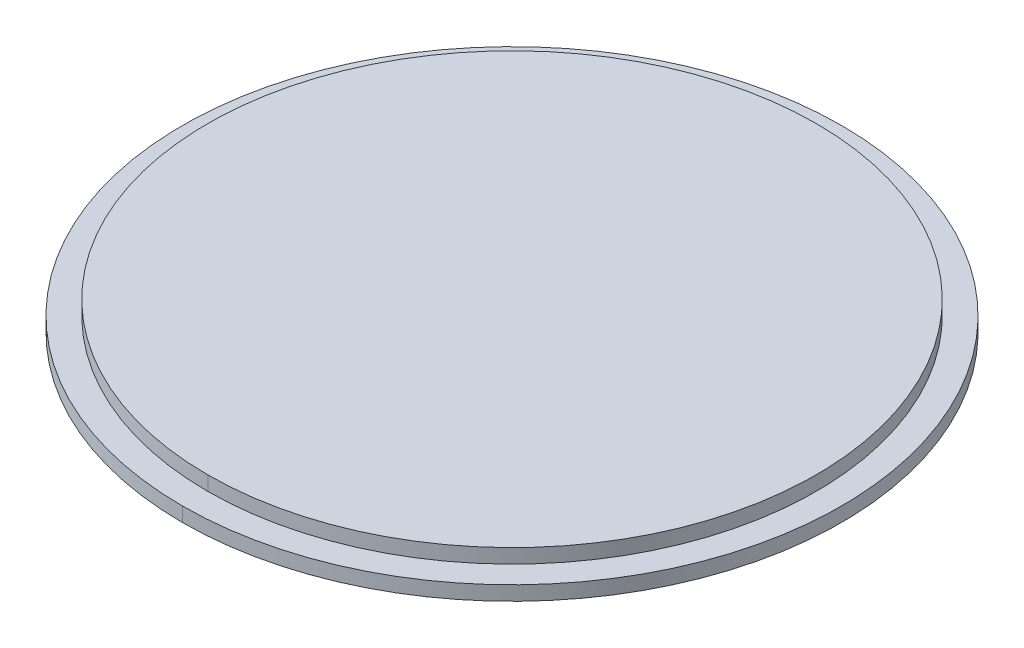
ISO-10303-21;
HEADER;
FILE_DESCRIPTION(('STEP AP214'),'2;1');
FILE_NAME('part.step','',(''),(''),'','','');
FILE_SCHEMA(('AUTOMOTIVE_DESIGN { 1 0 10303 214 1 1 1 1 }'));
ENDSEC;
DATA;
#1=APPLICATION_CONTEXT('core data for automotive mechanical design processes');
#2=APPLICATION_PROTOCOL_DEFINITION('international standard','automotive_design',2000,#1);
#3=PRODUCT_CONTEXT('',#1,'mechanical');
#4=PRODUCT('Part','Part','',(#3));
#5=PRODUCT_RELATED_PRODUCT_CATEGORY('part','',(#4));
#6=PRODUCT_DEFINITION_FORMATION('','',#4);
#7=PRODUCT_DEFINITION_CONTEXT('part definition',#1,'design');
#8=PRODUCT_DEFINITION('design','',#6,#7);
#9=PRODUCT_DEFINITION_SHAPE('','',#8);
#10=(LENGTH_UNIT() NAMED_UNIT(*) SI_UNIT(.MILLI.,.METRE.));
#11=(NAMED_UNIT(*) PLANE_ANGLE_UNIT() SI_UNIT($,.RADIAN.));
#12=(NAMED_UNIT(*) SI_UNIT($,.STERADIAN.) SOLID_ANGLE_UNIT());
#13=UNCERTAINTY_MEASURE_WITH_UNIT(LENGTH_MEASURE(1.E-05),#10,'distance_accuracy_value','');
#14=(GEOMETRIC_REPRESENTATION_CONTEXT(3) GLOBAL_UNCERTAINTY_ASSIGNED_CONTEXT((#13)) GLOBAL_UNIT_ASSIGNED_CONTEXT((#10,
#11,#12)) REPRESENTATION_CONTEXT('',''));
#15=CARTESIAN_POINT('',(0.,0.,0.));
#16=DIRECTION('',(0.,0.,1.));
#17=DIRECTION('',(1.,0.,0.));
#18=AXIS2_PLACEMENT_3D('',#15,#16,#17);
#19=CARTESIAN_POINT('',(0.,-4.49999999999985,0.));
#20=DIRECTION('',(0.,1.,0.));
#21=DIRECTION('',(0.,0.,-1.));
#22=AXIS2_PLACEMENT_3D('',#19,#20,#21);
#23=PLANE('',#22);
#24=CARTESIAN_POINT('',(0.,-4.49999999999985,0.));
#25=DIRECTION('',(0.,1.,0.));
#26=DIRECTION('',(0.,0.,-1.));
#27=AXIS2_PLACEMENT_3D('',#24,#25,#26);
#28=CIRCLE('',#27,31.85);
#29=CARTESIAN_POINT('',(0.,-4.49999999999985,-31.85));
#30=VERTEX_POINT('',#29);
#31=CARTESIAN_POINT('',(0.,-4.49999999999984,31.85));
#32=VERTEX_POINT('',#31);
#33=EDGE_CURVE('E26',#30,#32,#28,.T.);
#34=ORIENTED_EDGE('',*,*,#33,.F.);
#35=CARTESIAN_POINT('',(0.,-4.49999999999985,0.));
#36=DIRECTION('',(0.,-1.,0.));
#37=DIRECTION('',(0.,0.,-1.));
#38=AXIS2_PLACEMENT_3D('',#35,#36,#37);
#39=CIRCLE('',#38,31.85);
#40=EDGE_CURVE('E9',#30,#32,#39,.T.);
#41=ORIENTED_EDGE('',*,*,#40,.T.);
#42=EDGE_LOOP('',(#34,#41));
#43=FACE_BOUND('',#42,.T.);
#44=ADVANCED_FACE('F15',(#43),#23,.F.);
#45=CARTESIAN_POINT('',(0.,-4.72499999999984,0.));
#46=DIRECTION('',(0.,-1.,0.));
#47=DIRECTION('',(0.,0.,-1.));
#48=AXIS2_PLACEMENT_3D('',#45,#46,#47);
#49=CYLINDRICAL_SURFACE('',#48,31.85);
#50=ORIENTED_EDGE('',*,*,#33,.T.);
#51=DIRECTION('',(0.,1.,0.));
#52=VECTOR('',#51,1.);
#53=CARTESIAN_POINT('',(0.,-4.49999999999984,31.85));
#54=LINE('',#53,#52);
#55=CARTESIAN_POINT('',(0.,-2.9999999999999,31.85));
#56=VERTEX_POINT('',#55);
#57=EDGE_CURVE('E110',#32,#56,#54,.T.);
#58=ORIENTED_EDGE('',*,*,#57,.T.);
#59=CARTESIAN_POINT('',(0.,-2.9999999999999,0.));
#60=DIRECTION('',(0.,1.,0.));
#61=DIRECTION('',(0.,0.,-1.));
#62=AXIS2_PLACEMENT_3D('',#59,#60,#61);
#63=CIRCLE('',#62,31.85);
#64=CARTESIAN_POINT('',(0.,-2.9999999999999,-31.85));
#65=VERTEX_POINT('',#64);
#66=EDGE_CURVE('E120',#65,#56,#63,.T.);
#67=ORIENTED_EDGE('',*,*,#66,.F.);
#68=DIRECTION('',(0.,1.,0.));
#69=VECTOR('',#68,1.);
#70=CARTESIAN_POINT('',(0.,-4.49999999999985,-31.85));
#71=LINE('',#70,#69);
#72=EDGE_CURVE('E111',#30,#65,#71,.T.);
#73=ORIENTED_EDGE('',*,*,#72,.F.);
#74=EDGE_LOOP('',(#50,#58,#67,#73));
#75=FACE_BOUND('',#74,.T.);
#76=ADVANCED_FACE('F135',(#75),#49,.T.);
#77=CARTESIAN_POINT('',(0.,-4.72499999999984,0.));
#78=DIRECTION('',(0.,-1.,0.));
#79=DIRECTION('',(0.,0.,-1.));
#80=AXIS2_PLACEMENT_3D('',#77,#78,#79);
#81=CYLINDRICAL_SURFACE('',#80,31.85);
#82=CARTESIAN_POINT('',(0.,-2.9999999999999,0.));
#83=DIRECTION('',(0.,-1.,0.));
#84=DIRECTION('',(0.,0.,-1.));
#85=AXIS2_PLACEMENT_3D('',#82,#83,#84);
#86=CIRCLE('',#85,31.85);
#87=EDGE_CURVE('E107',#65,#56,#86,.T.);
#88=ORIENTED_EDGE('',*,*,#87,.T.);
#89=ORIENTED_EDGE('',*,*,#57,.F.);
#90=ORIENTED_EDGE('',*,*,#40,.F.);
#91=ORIENTED_EDGE('',*,*,#72,.T.);
#92=EDGE_LOOP('',(#88,#89,#90,#91));
#93=FACE_BOUND('',#92,.T.);
#94=ADVANCED_FACE('F129',(#93),#81,.T.);
#95=CARTESIAN_POINT('',(0.,-2.9999999999999,0.));
#96=DIRECTION('',(0.,1.,0.));
#97=DIRECTION('',(0.,0.,-1.));
#98=AXIS2_PLACEMENT_3D('',#95,#96,#97);
#99=PLANE('',#98);
#100=ORIENTED_EDGE('',*,*,#66,.T.);
#101=ORIENTED_EDGE('',*,*,#87,.F.);
#102=EDGE_LOOP('',(#100,#101));
#103=FACE_BOUND('',#102,.T.);
#104=CARTESIAN_POINT('',(0.,-2.9999999999999,0.));
#105=DIRECTION('',(0.,-1.,0.));
#106=DIRECTION('',(0.,0.,-1.));
#107=AXIS2_PLACEMENT_3D('',#104,#105,#106);
#108=CIRCLE('',#107,34.5);
#109=CARTESIAN_POINT('',(0.,-2.9999999999999,-34.5));
#110=VERTEX_POINT('',#109);
#111=CARTESIAN_POINT('',(0.,-2.9999999999999,34.5));
#112=VERTEX_POINT('',#111);
#113=EDGE_CURVE('E119',#110,#112,#108,.T.);
#114=ORIENTED_EDGE('',*,*,#113,.T.);
#115=CARTESIAN_POINT('',(0.,-2.9999999999999,0.));
#116=DIRECTION('',(0.,1.,0.));
#117=DIRECTION('',(0.,0.,-1.));
#118=AXIS2_PLACEMENT_3D('',#115,#116,#117);
#119=CIRCLE('',#118,34.5);
#120=EDGE_CURVE('E93',#110,#112,#119,.T.);
#121=ORIENTED_EDGE('',*,*,#120,.F.);
#122=EDGE_LOOP('',(#114,#121));
#123=FACE_BOUND('',#122,.T.);
#124=ADVANCED_FACE('F133',(#103,#123),#99,.F.);
#125=CARTESIAN_POINT('',(0.,-4.72499999999984,0.));
#126=DIRECTION('',(0.,-1.,0.));
#127=DIRECTION('',(0.,0.,-1.));
#128=AXIS2_PLACEMENT_3D('',#125,#126,#127);
#129=CYLINDRICAL_SURFACE('',#128,34.5);
#130=CARTESIAN_POINT('',(0.,-1.5,0.));
#131=DIRECTION('',(0.,-1.,0.));
#132=DIRECTION('',(0.,0.,-1.));
#133=AXIS2_PLACEMENT_3D('',#130,#131,#132);
#134=CIRCLE('',#133,34.5);
#135=CARTESIAN_POINT('',(0.,-1.5,-34.5));
#136=VERTEX_POINT('',#135);
#137=CARTESIAN_POINT('',(0.,-1.5,34.5));
#138=VERTEX_POINT('',#137);
#139=EDGE_CURVE('E106',#136,#138,#134,.T.);
#140=ORIENTED_EDGE('',*,*,#139,.T.);
#141=DIRECTION('',(0.,1.,0.));
#142=VECTOR('',#141,1.);
#143=CARTESIAN_POINT('',(0.,-2.9999999999999,34.5));
#144=LINE('',#143,#142);
#145=EDGE_CURVE('E97',#112,#138,#144,.T.);
#146=ORIENTED_EDGE('',*,*,#145,.F.);
#147=ORIENTED_EDGE('',*,*,#113,.F.);
#148=DIRECTION('',(0.,1.,0.));
#149=VECTOR('',#148,1.);
#150=CARTESIAN_POINT('',(0.,-2.9999999999999,-34.5));
#151=LINE('',#150,#149);
#152=EDGE_CURVE('E96',#110,#136,#151,.T.);
#153=ORIENTED_EDGE('',*,*,#152,.T.);
#154=EDGE_LOOP('',(#140,#146,#147,#153));
#155=FACE_BOUND('',#154,.T.);
#156=ADVANCED_FACE('F153',(#155),#129,.T.);
#157=CARTESIAN_POINT('',(0.,-4.72499999999984,0.));
#158=DIRECTION('',(0.,-1.,0.));
#159=DIRECTION('',(0.,0.,-1.));
#160=AXIS2_PLACEMENT_3D('',#157,#158,#159);
#161=CYLINDRICAL_SURFACE('',#160,34.5);
#162=ORIENTED_EDGE('',*,*,#120,.T.);
#163=ORIENTED_EDGE('',*,*,#145,.T.);
#164=CARTESIAN_POINT('',(0.,-1.5,0.));
#165=DIRECTION('',(0.,1.,0.));
#166=DIRECTION('',(0.,0.,-1.));
#167=AXIS2_PLACEMENT_3D('',#164,#165,#166);
#168=CIRCLE('',#167,34.5);
#169=EDGE_CURVE('E98',#136,#138,#168,.T.);
#170=ORIENTED_EDGE('',*,*,#169,.F.);
#171=ORIENTED_EDGE('',*,*,#152,.F.);
#172=EDGE_LOOP('',(#162,#163,#170,#171));
#173=FACE_BOUND('',#172,.T.);
#174=ADVANCED_FACE('F156',(#173),#161,.T.);
#175=CARTESIAN_POINT('',(0.,-1.5,0.));
#176=DIRECTION('',(0.,1.,0.));
#177=DIRECTION('',(0.,0.,-1.));
#178=AXIS2_PLACEMENT_3D('',#175,#176,#177);
#179=PLANE('',#178);
#180=ORIENTED_EDGE('',*,*,#169,.T.);
#181=ORIENTED_EDGE('',*,*,#139,.F.);
#182=EDGE_LOOP('',(#180,#181));
#183=FACE_BOUND('',#182,.T.);
#184=CARTESIAN_POINT('',(0.,-1.5,0.));
#185=DIRECTION('',(0.,-1.,0.));
#186=DIRECTION('',(0.,0.,-1.));
#187=AXIS2_PLACEMENT_3D('',#184,#185,#186);
#188=CIRCLE('',#187,31.85);
#189=CARTESIAN_POINT('',(0.,-1.5,-31.85));
#190=VERTEX_POINT('',#189);
#191=CARTESIAN_POINT('',(0.,-1.5,31.85));
#192=VERTEX_POINT('',#191);
#193=EDGE_CURVE('E72',#190,#192,#188,.T.);
#194=ORIENTED_EDGE('',*,*,#193,.T.);
#195=CARTESIAN_POINT('',(0.,-1.5,0.));
#196=DIRECTION('',(0.,1.,0.));
#197=DIRECTION('',(0.,0.,-1.));
#198=AXIS2_PLACEMENT_3D('',#195,#196,#197);
#199=CIRCLE('',#198,31.85);
#200=EDGE_CURVE('E19',#190,#192,#199,.T.);
#201=ORIENTED_EDGE('',*,*,#200,.F.);
#202=EDGE_LOOP('',(#194,#201));
#203=FACE_BOUND('',#202,.T.);
#204=ADVANCED_FACE('F146',(#183,#203),#179,.T.);
#205=CARTESIAN_POINT('',(0.,-4.72499999999984,0.));
#206=DIRECTION('',(0.,-1.,0.));
#207=DIRECTION('',(0.,0.,-1.));
#208=AXIS2_PLACEMENT_3D('',#205,#206,#207);
#209=CYLINDRICAL_SURFACE('',#208,31.85);
#210=CARTESIAN_POINT('',(0.,0.,0.));
#211=DIRECTION('',(0.,-1.,0.));
#212=DIRECTION('',(0.,0.,-1.));
#213=AXIS2_PLACEMENT_3D('',#210,#211,#212);
#214=CIRCLE('',#213,31.85);
#215=CARTESIAN_POINT('',(0.,0.,-31.85));
#216=VERTEX_POINT('',#215);
#217=CARTESIAN_POINT('',(0.,0.,31.85));
#218=VERTEX_POINT('',#217);
#219=EDGE_CURVE('E69',#216,#218,#214,.T.);
#220=ORIENTED_EDGE('',*,*,#219,.T.);
#221=DIRECTION('',(0.,1.,0.));
#222=VECTOR('',#221,1.);
#223=CARTESIAN_POINT('',(0.,-1.5,31.85));
#224=LINE('',#223,#222);
#225=EDGE_CURVE('E82',#192,#218,#224,.T.);
#226=ORIENTED_EDGE('',*,*,#225,.F.);
#227=ORIENTED_EDGE('',*,*,#193,.F.);
#228=DIRECTION('',(0.,1.,0.));
#229=VECTOR('',#228,1.);
#230=CARTESIAN_POINT('',(0.,-1.5,-31.85));
#231=LINE('',#230,#229);
#232=EDGE_CURVE('E65',#190,#216,#231,.T.);
#233=ORIENTED_EDGE('',*,*,#232,.T.);
#234=EDGE_LOOP('',(#220,#226,#227,#233));
#235=FACE_BOUND('',#234,.T.);
#236=ADVANCED_FACE('F67',(#235),#209,.T.);
#237=CARTESIAN_POINT('',(0.,-4.72499999999984,0.));
#238=DIRECTION('',(0.,-1.,0.));
#239=DIRECTION('',(0.,0.,-1.));
#240=AXIS2_PLACEMENT_3D('',#237,#238,#239);
#241=CYLINDRICAL_SURFACE('',#240,31.85);
#242=ORIENTED_EDGE('',*,*,#200,.T.);
#243=ORIENTED_EDGE('',*,*,#225,.T.);
#244=CARTESIAN_POINT('',(0.,0.,0.));
#245=DIRECTION('',(0.,1.,0.));
#246=DIRECTION('',(0.,0.,-1.));
#247=AXIS2_PLACEMENT_3D('',#244,#245,#246);
#248=CIRCLE('',#247,31.85);
#249=EDGE_CURVE('E78',#216,#218,#248,.T.);
#250=ORIENTED_EDGE('',*,*,#249,.F.);
#251=ORIENTED_EDGE('',*,*,#232,.F.);
#252=EDGE_LOOP('',(#242,#243,#250,#251));
#253=FACE_BOUND('',#252,.T.);
#254=ADVANCED_FACE('F81',(#253),#241,.T.);
#255=CARTESIAN_POINT('',(0.,0.,0.));
#256=DIRECTION('',(0.,1.,0.));
#257=DIRECTION('',(0.,0.,-1.));
#258=AXIS2_PLACEMENT_3D('',#255,#256,#257);
#259=PLANE('',#258);
#260=ORIENTED_EDGE('',*,*,#249,.T.);
#261=ORIENTED_EDGE('',*,*,#219,.F.);
#262=EDGE_LOOP('',(#260,#261));
#263=FACE_BOUND('',#262,.T.);
#264=ADVANCED_FACE('F17',(#263),#259,.T.);
#265=CLOSED_SHELL('',(#44,#76,#94,#124,#156,#174,#204,#236,#254,#264));
#266=MANIFOLD_SOLID_BREP('B1',#265);
#267=ADVANCED_BREP_SHAPE_REPRESENTATION('',(#18,#266),#14);
#268=SHAPE_DEFINITION_REPRESENTATION(#9,#267);
ENDSEC;
END-ISO-10303-21;
